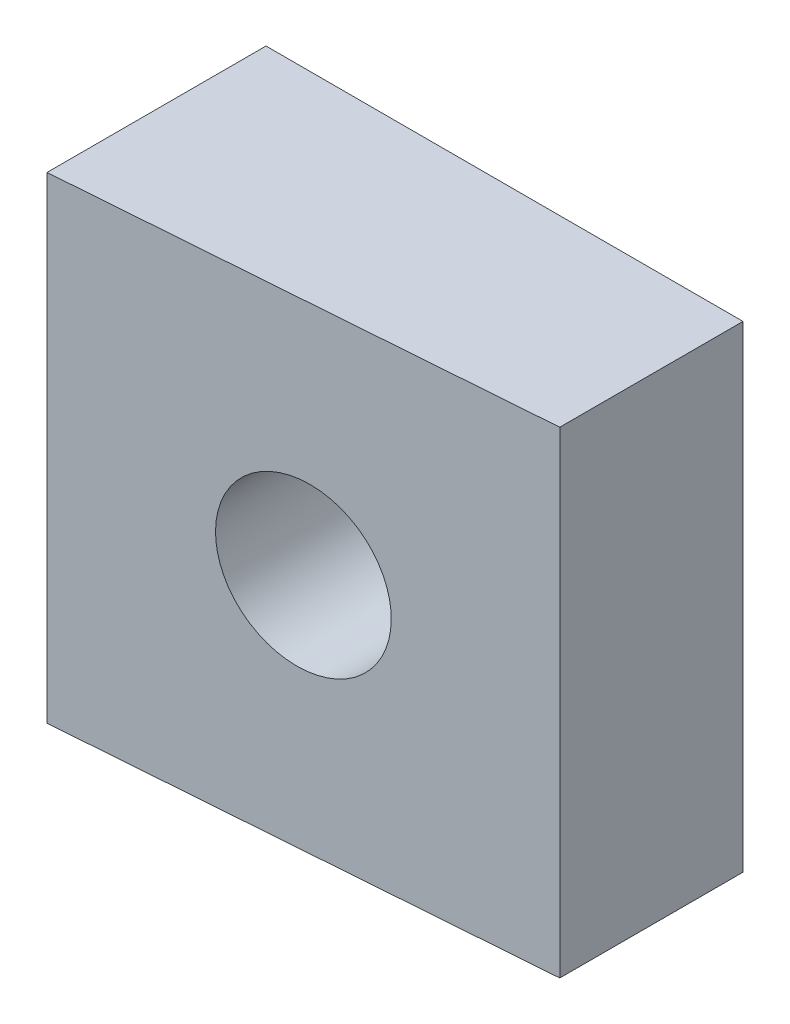
ISO-10303-21;
HEADER;
FILE_DESCRIPTION(('STEP AP214'),'2;1');
FILE_NAME('part.step','',(''),(''),'','','');
FILE_SCHEMA(('AUTOMOTIVE_DESIGN { 1 0 10303 214 1 1 1 1 }'));
ENDSEC;
DATA;
#1=APPLICATION_CONTEXT('core data for automotive mechanical design processes');
#2=APPLICATION_PROTOCOL_DEFINITION('international standard','automotive_design',2000,#1);
#3=PRODUCT_CONTEXT('',#1,'mechanical');
#4=PRODUCT('Part','Part','',(#3));
#5=PRODUCT_RELATED_PRODUCT_CATEGORY('part','',(#4));
#6=PRODUCT_DEFINITION_FORMATION('','',#4);
#7=PRODUCT_DEFINITION_CONTEXT('part definition',#1,'design');
#8=PRODUCT_DEFINITION('design','',#6,#7);
#9=PRODUCT_DEFINITION_SHAPE('','',#8);
#10=(LENGTH_UNIT() NAMED_UNIT(*) SI_UNIT(.MILLI.,.METRE.));
#11=(NAMED_UNIT(*) PLANE_ANGLE_UNIT() SI_UNIT($,.RADIAN.));
#12=(NAMED_UNIT(*) SI_UNIT($,.STERADIAN.) SOLID_ANGLE_UNIT());
#13=UNCERTAINTY_MEASURE_WITH_UNIT(LENGTH_MEASURE(1.E-05),#10,'distance_accuracy_value','');
#14=(GEOMETRIC_REPRESENTATION_CONTEXT(3) GLOBAL_UNCERTAINTY_ASSIGNED_CONTEXT((#13)) GLOBAL_UNIT_ASSIGNED_CONTEXT((#10,
#11,#12)) REPRESENTATION_CONTEXT('',''));
#15=CARTESIAN_POINT('',(0.,0.,0.));
#16=DIRECTION('',(0.,0.,1.));
#17=DIRECTION('',(1.,0.,0.));
#18=AXIS2_PLACEMENT_3D('',#15,#16,#17);
#19=CARTESIAN_POINT('',(0.,0.,0.));
#20=DIRECTION('',(0.,0.,-1.));
#21=DIRECTION('',(-1.,0.,0.));
#22=AXIS2_PLACEMENT_3D('',#19,#20,#21);
#23=PLANE('',#22);
#24=CARTESIAN_POINT('',(9.525,9.525,0.));
#25=DIRECTION('',(0.,0.,-1.));
#26=DIRECTION('',(-1.,0.,0.));
#27=AXIS2_PLACEMENT_3D('',#24,#25,#26);
#28=CIRCLE('',#27,3.2639);
#29=CARTESIAN_POINT('',(6.2611,9.525,0.));
#30=VERTEX_POINT('',#29);
#31=EDGE_CURVE('E100',#30,#30,#28,.T.);
#32=ORIENTED_EDGE('',*,*,#31,.F.);
#33=EDGE_LOOP('',(#32));
#34=FACE_BOUND('',#33,.T.);
#35=DIRECTION('',(0.,-1.,0.));
#36=VECTOR('',#35,1.);
#37=CARTESIAN_POINT('',(0.,0.,0.));
#38=LINE('',#37,#36);
#39=CARTESIAN_POINT('',(0.,19.05,0.));
#40=VERTEX_POINT('',#39);
#41=CARTESIAN_POINT('',(0.,0.,0.));
#42=VERTEX_POINT('',#41);
#43=EDGE_CURVE('E91',#40,#42,#38,.T.);
#44=ORIENTED_EDGE('',*,*,#43,.F.);
#45=DIRECTION('',(-1.,0.,0.));
#46=VECTOR('',#45,1.);
#47=CARTESIAN_POINT('',(0.,19.05,0.));
#48=LINE('',#47,#46);
#49=CARTESIAN_POINT('',(19.05,19.05,0.));
#50=VERTEX_POINT('',#49);
#51=EDGE_CURVE('E104',#50,#40,#48,.T.);
#52=ORIENTED_EDGE('',*,*,#51,.F.);
#53=DIRECTION('',(0.,1.,0.));
#54=VECTOR('',#53,1.);
#55=CARTESIAN_POINT('',(19.05,0.,0.));
#56=LINE('',#55,#54);
#57=CARTESIAN_POINT('',(19.05,0.,0.));
#58=VERTEX_POINT('',#57);
#59=EDGE_CURVE('E93',#58,#50,#56,.T.);
#60=ORIENTED_EDGE('',*,*,#59,.F.);
#61=DIRECTION('',(1.,0.,0.));
#62=VECTOR('',#61,1.);
#63=CARTESIAN_POINT('',(0.,0.,0.));
#64=LINE('',#63,#62);
#65=EDGE_CURVE('E82',#42,#58,#64,.T.);
#66=ORIENTED_EDGE('',*,*,#65,.F.);
#67=EDGE_LOOP('',(#44,#52,#60,#66));
#68=FACE_BOUND('',#67,.T.);
#69=ADVANCED_FACE('F39',(#34,#68),#23,.T.);
#70=CARTESIAN_POINT('',(0.,19.05,35.0107156950823));
#71=DIRECTION('',(0.,-1.,0.));
#72=DIRECTION('',(0.,0.,-1.));
#73=AXIS2_PLACEMENT_3D('',#70,#71,#72);
#74=PLANE('',#73);
#75=DIRECTION('',(0.,0.,-1.));
#76=VECTOR('',#75,1.);
#77=CARTESIAN_POINT('',(0.,19.05,35.0107156950823));
#78=LINE('',#77,#76);
#79=CARTESIAN_POINT('',(0.,19.05,8.74649000347009));
#80=VERTEX_POINT('',#79);
#81=EDGE_CURVE('E96',#80,#40,#78,.T.);
#82=ORIENTED_EDGE('',*,*,#81,.F.);
#83=DIRECTION('',(0.997199309888457,0.,-0.0747899482416341));
#84=VECTOR('',#83,1.);
#85=CARTESIAN_POINT('',(-1.95879868427188,19.05,8.89339990479048));
#86=LINE('',#85,#84);
#87=CARTESIAN_POINT('',(19.05,19.05,7.31774000347009));
#88=VERTEX_POINT('',#87);
#89=EDGE_CURVE('E60',#80,#88,#86,.T.);
#90=ORIENTED_EDGE('',*,*,#89,.T.);
#91=DIRECTION('',(0.,0.,-1.));
#92=VECTOR('',#91,1.);
#93=CARTESIAN_POINT('',(19.05,19.05,35.0107156950823));
#94=LINE('',#93,#92);
#95=EDGE_CURVE('E107',#88,#50,#94,.T.);
#96=ORIENTED_EDGE('',*,*,#95,.T.);
#97=ORIENTED_EDGE('',*,*,#51,.T.);
#98=EDGE_LOOP('',(#82,#90,#96,#97));
#99=FACE_BOUND('',#98,.T.);
#100=ADVANCED_FACE('F123',(#99),#74,.F.);
#101=CARTESIAN_POINT('',(19.05,0.,35.0107156950823));
#102=DIRECTION('',(-1.,0.,0.));
#103=DIRECTION('',(0.,0.,1.));
#104=AXIS2_PLACEMENT_3D('',#101,#102,#103);
#105=PLANE('',#104);
#106=ORIENTED_EDGE('',*,*,#95,.F.);
#107=DIRECTION('',(0.,-1.,0.));
#108=VECTOR('',#107,1.);
#109=CARTESIAN_POINT('',(19.05,-1.64735262777289E-12,7.31774000347122));
#110=LINE('',#109,#108);
#111=CARTESIAN_POINT('',(19.05,0.,7.31774000347122));
#112=VERTEX_POINT('',#111);
#113=EDGE_CURVE('E109',#88,#112,#110,.T.);
#114=ORIENTED_EDGE('',*,*,#113,.T.);
#115=DIRECTION('',(0.,0.,-1.));
#116=VECTOR('',#115,1.);
#117=CARTESIAN_POINT('',(19.05,0.,35.0107156950823));
#118=LINE('',#117,#116);
#119=EDGE_CURVE('E86',#112,#58,#118,.T.);
#120=ORIENTED_EDGE('',*,*,#119,.T.);
#121=ORIENTED_EDGE('',*,*,#59,.T.);
#122=EDGE_LOOP('',(#106,#114,#120,#121));
#123=FACE_BOUND('',#122,.T.);
#124=ADVANCED_FACE('F130',(#123),#105,.F.);
#125=CARTESIAN_POINT('',(0.,0.,35.0107156950823));
#126=DIRECTION('',(0.,1.,0.));
#127=DIRECTION('',(0.,0.,1.));
#128=AXIS2_PLACEMENT_3D('',#125,#126,#127);
#129=PLANE('',#128);
#130=ORIENTED_EDGE('',*,*,#119,.F.);
#131=DIRECTION('',(-0.997199309888457,0.,0.0747899482416341));
#132=VECTOR('',#131,1.);
#133=CARTESIAN_POINT('',(-1.9587986842718,0.,8.89339990479161));
#134=LINE('',#133,#132);
#135=CARTESIAN_POINT('',(0.,0.,8.74649000347123));
#136=VERTEX_POINT('',#135);
#137=EDGE_CURVE('E48',#112,#136,#134,.T.);
#138=ORIENTED_EDGE('',*,*,#137,.T.);
#139=DIRECTION('',(0.,0.,-1.));
#140=VECTOR('',#139,1.);
#141=CARTESIAN_POINT('',(0.,0.,35.0107156950823));
#142=LINE('',#141,#140);
#143=EDGE_CURVE('E79',#136,#42,#142,.T.);
#144=ORIENTED_EDGE('',*,*,#143,.T.);
#145=ORIENTED_EDGE('',*,*,#65,.T.);
#146=EDGE_LOOP('',(#130,#138,#144,#145));
#147=FACE_BOUND('',#146,.T.);
#148=ADVANCED_FACE('F81',(#147),#129,.F.);
#149=CARTESIAN_POINT('',(0.,0.,35.0107156950823));
#150=DIRECTION('',(1.,0.,0.));
#151=DIRECTION('',(0.,0.,-1.));
#152=AXIS2_PLACEMENT_3D('',#149,#150,#151);
#153=PLANE('',#152);
#154=ORIENTED_EDGE('',*,*,#143,.F.);
#155=DIRECTION('',(0.,1.,0.));
#156=VECTOR('',#155,1.);
#157=CARTESIAN_POINT('',(0.,-1.56236157830457E-12,8.74649000347123));
#158=LINE('',#157,#156);
#159=EDGE_CURVE('E11',#136,#80,#158,.T.);
#160=ORIENTED_EDGE('',*,*,#159,.T.);
#161=ORIENTED_EDGE('',*,*,#81,.T.);
#162=ORIENTED_EDGE('',*,*,#43,.T.);
#163=EDGE_LOOP('',(#154,#160,#161,#162));
#164=FACE_BOUND('',#163,.T.);
#165=ADVANCED_FACE('F41',(#164),#153,.F.);
#166=CARTESIAN_POINT('',(1435.00191159895,301.017960493455,-98.8786533664677));
#167=DIRECTION('',(-0.0747899482416341,0.,-0.997199309888457));
#168=DIRECTION('',(-0.997199309888457,-3.9059151776721E-13,0.0747899482416341));
#169=AXIS2_PLACEMENT_3D('',#166,#167,#168);
#170=PLANE('',#169);
#171=CARTESIAN_POINT('',(9.525,9.525,8.03211500347066));
#172=DIRECTION('',(-0.0747899482416341,0.,-0.997199309888457));
#173=DIRECTION('',(0.997199309888457,7.90929282020392E-13,-0.0747899482416341));
#174=AXIS2_PLACEMENT_3D('',#171,#172,#173);
#175=ELLIPSE('',#174,3.27306684594987,3.2639);
#176=CARTESIAN_POINT('',(12.7889,9.52500000000259,7.78732250347066));
#177=VERTEX_POINT('',#176);
#178=EDGE_CURVE('E43',#177,#177,#175,.T.);
#179=ORIENTED_EDGE('',*,*,#178,.T.);
#180=EDGE_LOOP('',(#179));
#181=FACE_BOUND('',#180,.T.);
#182=ORIENTED_EDGE('',*,*,#137,.F.);
#183=ORIENTED_EDGE('',*,*,#113,.F.);
#184=ORIENTED_EDGE('',*,*,#89,.F.);
#185=ORIENTED_EDGE('',*,*,#159,.F.);
#186=EDGE_LOOP('',(#182,#183,#184,#185));
#187=FACE_BOUND('',#186,.T.);
#188=ADVANCED_FACE('F133',(#181,#187),#170,.F.);
#189=CARTESIAN_POINT('',(9.525,9.525,8.74649000347123));
#190=DIRECTION('',(0.,0.,-1.));
#191=DIRECTION('',(-1.,0.,0.));
#192=AXIS2_PLACEMENT_3D('',#189,#190,#191);
#193=CYLINDRICAL_SURFACE('',#192,3.2639);
#194=ORIENTED_EDGE('',*,*,#31,.T.);
#195=EDGE_LOOP('',(#194));
#196=FACE_BOUND('',#195,.T.);
#197=ORIENTED_EDGE('',*,*,#178,.F.);
#198=EDGE_LOOP('',(#197));
#199=FACE_BOUND('',#198,.T.);
#200=ADVANCED_FACE('F119',(#196,#199),#193,.F.);
#201=CLOSED_SHELL('',(#69,#100,#124,#148,#165,#188,#200));
#202=MANIFOLD_SOLID_BREP('B2',#201);
#203=ADVANCED_BREP_SHAPE_REPRESENTATION('',(#18,#202),#14);
#204=SHAPE_DEFINITION_REPRESENTATION(#9,#203);
ENDSEC;
END-ISO-10303-21;
